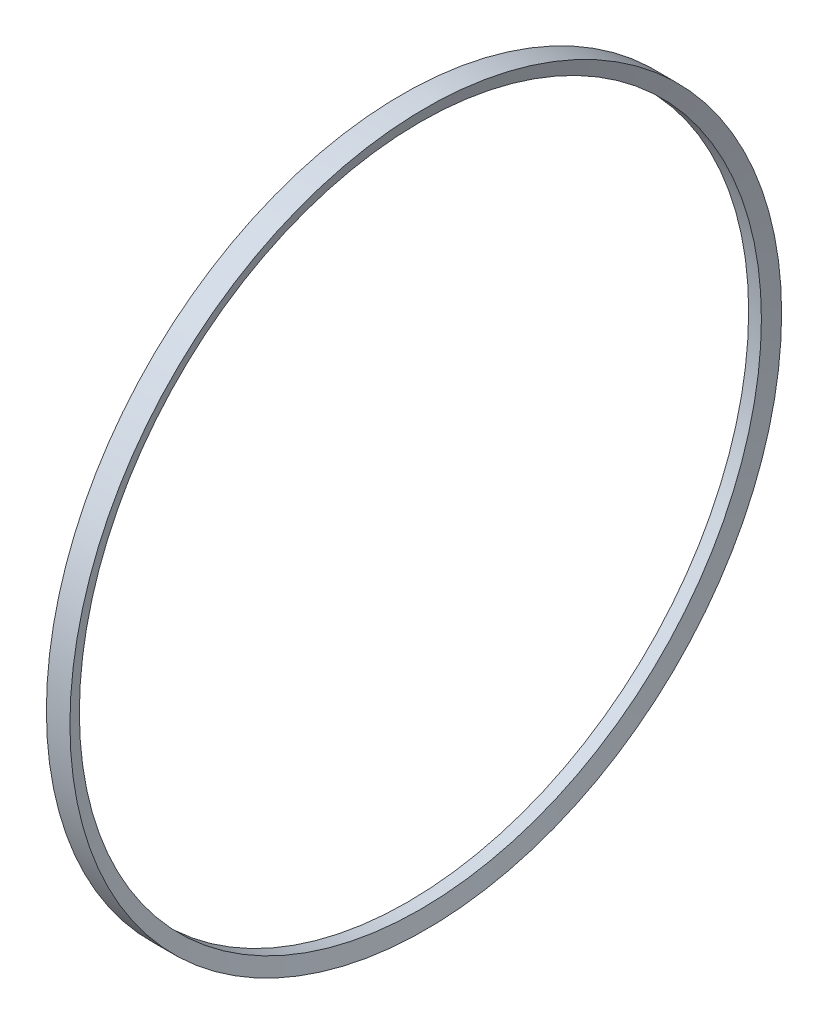
ISO-10303-21;
HEADER;
FILE_DESCRIPTION(('STEP AP214'),'2;1');
FILE_NAME('part.step','',(''),(''),'','','');
FILE_SCHEMA(('AUTOMOTIVE_DESIGN { 1 0 10303 214 1 1 1 1 }'));
ENDSEC;
DATA;
#1=APPLICATION_CONTEXT('core data for automotive mechanical design processes');
#2=APPLICATION_PROTOCOL_DEFINITION('international standard','automotive_design',2000,#1);
#3=PRODUCT_CONTEXT('',#1,'mechanical');
#4=PRODUCT('Part','Part','',(#3));
#5=PRODUCT_RELATED_PRODUCT_CATEGORY('part','',(#4));
#6=PRODUCT_DEFINITION_FORMATION('','',#4);
#7=PRODUCT_DEFINITION_CONTEXT('part definition',#1,'design');
#8=PRODUCT_DEFINITION('design','',#6,#7);
#9=PRODUCT_DEFINITION_SHAPE('','',#8);
#10=(LENGTH_UNIT() NAMED_UNIT(*) SI_UNIT(.MILLI.,.METRE.));
#11=(NAMED_UNIT(*) PLANE_ANGLE_UNIT() SI_UNIT($,.RADIAN.));
#12=(NAMED_UNIT(*) SI_UNIT($,.STERADIAN.) SOLID_ANGLE_UNIT());
#13=UNCERTAINTY_MEASURE_WITH_UNIT(LENGTH_MEASURE(1.E-05),#10,'distance_accuracy_value','');
#14=(GEOMETRIC_REPRESENTATION_CONTEXT(3) GLOBAL_UNCERTAINTY_ASSIGNED_CONTEXT((#13)) GLOBAL_UNIT_ASSIGNED_CONTEXT((#10,
#11,#12)) REPRESENTATION_CONTEXT('',''));
#15=CARTESIAN_POINT('',(0.,0.,0.));
#16=DIRECTION('',(0.,0.,1.));
#17=DIRECTION('',(1.,0.,0.));
#18=AXIS2_PLACEMENT_3D('',#15,#16,#17);
#19=CARTESIAN_POINT('',(3.43823812587043,0.,0.));
#20=DIRECTION('',(1.,0.,0.));
#21=DIRECTION('',(0.,0.,-1.));
#22=AXIS2_PLACEMENT_3D('',#19,#20,#21);
#23=CONICAL_SURFACE('',#22,184.,1.22173047639604);
#24=CARTESIAN_POINT('',(6.35,0.,0.));
#25=DIRECTION('',(-1.,0.,0.));
#26=DIRECTION('',(0.,0.,1.));
#27=AXIS2_PLACEMENT_3D('',#24,#25,#26);
#28=CIRCLE('',#27,192.);
#29=CARTESIAN_POINT('',(6.35,0.,192.));
#30=VERTEX_POINT('',#29);
#31=EDGE_CURVE('E10',#30,#30,#28,.T.);
#32=ORIENTED_EDGE('',*,*,#31,.F.);
#33=EDGE_LOOP('',(#32));
#34=FACE_BOUND('',#33,.T.);
#35=CARTESIAN_POINT('',(3.43823812587043,0.,0.));
#36=DIRECTION('',(-1.,0.,0.));
#37=DIRECTION('',(0.,0.,1.));
#38=AXIS2_PLACEMENT_3D('',#35,#36,#37);
#39=CIRCLE('',#38,184.);
#40=CARTESIAN_POINT('',(3.43823812587043,0.,184.));
#41=VERTEX_POINT('',#40);
#42=EDGE_CURVE('E45',#41,#41,#39,.T.);
#43=ORIENTED_EDGE('',*,*,#42,.T.);
#44=EDGE_LOOP('',(#43));
#45=FACE_BOUND('',#44,.T.);
#46=ADVANCED_FACE('F31',(#34,#45),#23,.F.);
#47=CARTESIAN_POINT('',(0.,0.,0.));
#48=DIRECTION('',(-1.,0.,0.));
#49=DIRECTION('',(0.,0.,1.));
#50=AXIS2_PLACEMENT_3D('',#47,#48,#49);
#51=CYLINDRICAL_SURFACE('',#50,192.);
#52=CARTESIAN_POINT('',(-6.35,0.,0.));
#53=DIRECTION('',(-1.,0.,0.));
#54=DIRECTION('',(0.,0.,1.));
#55=AXIS2_PLACEMENT_3D('',#52,#53,#54);
#56=CIRCLE('',#55,192.);
#57=CARTESIAN_POINT('',(-6.35,0.,192.));
#58=VERTEX_POINT('',#57);
#59=EDGE_CURVE('E37',#58,#58,#56,.T.);
#60=ORIENTED_EDGE('',*,*,#59,.F.);
#61=EDGE_LOOP('',(#60));
#62=FACE_BOUND('',#61,.T.);
#63=ORIENTED_EDGE('',*,*,#31,.T.);
#64=EDGE_LOOP('',(#63));
#65=FACE_BOUND('',#64,.T.);
#66=ADVANCED_FACE('F60',(#62,#65),#51,.T.);
#67=CARTESIAN_POINT('',(-6.35,0.,0.));
#68=DIRECTION('',(-1.,0.,0.));
#69=DIRECTION('',(0.,0.,1.));
#70=AXIS2_PLACEMENT_3D('',#67,#68,#69);
#71=CONICAL_SURFACE('',#70,192.,1.22173047639604);
#72=CARTESIAN_POINT('',(-3.43823812587043,0.,0.));
#73=DIRECTION('',(-1.,0.,0.));
#74=DIRECTION('',(0.,0.,1.));
#75=AXIS2_PLACEMENT_3D('',#72,#73,#74);
#76=CIRCLE('',#75,184.);
#77=CARTESIAN_POINT('',(-3.43823812587043,0.,184.));
#78=VERTEX_POINT('',#77);
#79=EDGE_CURVE('E41',#78,#78,#76,.T.);
#80=ORIENTED_EDGE('',*,*,#79,.F.);
#81=EDGE_LOOP('',(#80));
#82=FACE_BOUND('',#81,.T.);
#83=ORIENTED_EDGE('',*,*,#59,.T.);
#84=EDGE_LOOP('',(#83));
#85=FACE_BOUND('',#84,.T.);
#86=ADVANCED_FACE('F55',(#82,#85),#71,.F.);
#87=CARTESIAN_POINT('',(0.,0.,0.));
#88=DIRECTION('',(-1.,0.,0.));
#89=DIRECTION('',(0.,0.,1.));
#90=AXIS2_PLACEMENT_3D('',#87,#88,#89);
#91=CYLINDRICAL_SURFACE('',#90,184.);
#92=ORIENTED_EDGE('',*,*,#42,.F.);
#93=EDGE_LOOP('',(#92));
#94=FACE_BOUND('',#93,.T.);
#95=ORIENTED_EDGE('',*,*,#79,.T.);
#96=EDGE_LOOP('',(#95));
#97=FACE_BOUND('',#96,.T.);
#98=ADVANCED_FACE('F52',(#94,#97),#91,.F.);
#99=CLOSED_SHELL('',(#46,#66,#86,#98));
#100=MANIFOLD_SOLID_BREP('B2',#99);
#101=ADVANCED_BREP_SHAPE_REPRESENTATION('',(#18,#100),#14);
#102=SHAPE_DEFINITION_REPRESENTATION(#9,#101);
ENDSEC;
END-ISO-10303-21;
